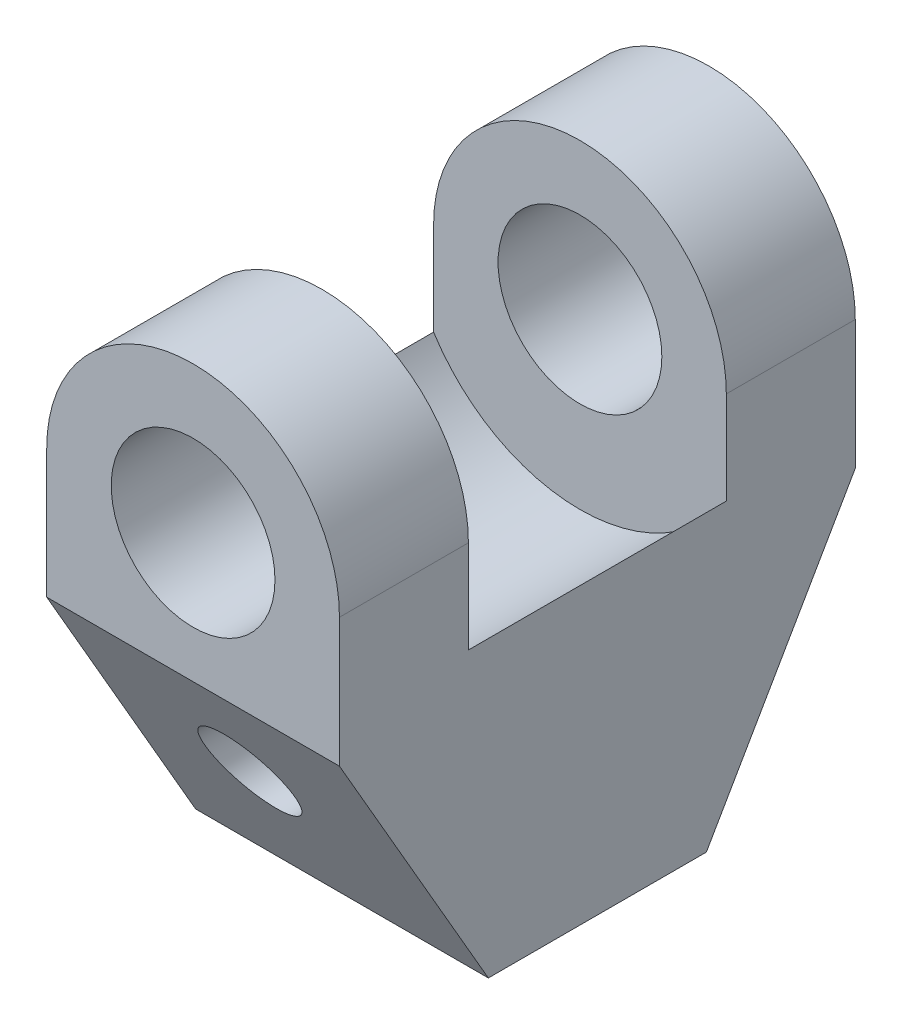
ISO-10303-21;
HEADER;
FILE_DESCRIPTION(('STEP AP214'),'2;1');
FILE_NAME('part.step','',(''),(''),'','','');
FILE_SCHEMA(('AUTOMOTIVE_DESIGN { 1 0 10303 214 1 1 1 1 }'));
ENDSEC;
DATA;
#1=APPLICATION_CONTEXT('core data for automotive mechanical design processes');
#2=APPLICATION_PROTOCOL_DEFINITION('international standard','automotive_design',2000,#1);
#3=PRODUCT_CONTEXT('',#1,'mechanical');
#4=PRODUCT('Part','Part','',(#3));
#5=PRODUCT_RELATED_PRODUCT_CATEGORY('part','',(#4));
#6=PRODUCT_DEFINITION_FORMATION('','',#4);
#7=PRODUCT_DEFINITION_CONTEXT('part definition',#1,'design');
#8=PRODUCT_DEFINITION('design','',#6,#7);
#9=PRODUCT_DEFINITION_SHAPE('','',#8);
#10=(LENGTH_UNIT() NAMED_UNIT(*) SI_UNIT(.MILLI.,.METRE.));
#11=(NAMED_UNIT(*) PLANE_ANGLE_UNIT() SI_UNIT($,.RADIAN.));
#12=(NAMED_UNIT(*) SI_UNIT($,.STERADIAN.) SOLID_ANGLE_UNIT());
#13=UNCERTAINTY_MEASURE_WITH_UNIT(LENGTH_MEASURE(1.E-05),#10,'distance_accuracy_value','');
#14=(GEOMETRIC_REPRESENTATION_CONTEXT(3) GLOBAL_UNCERTAINTY_ASSIGNED_CONTEXT((#13)) GLOBAL_UNIT_ASSIGNED_CONTEXT((#10,
#11,#12)) REPRESENTATION_CONTEXT('',''));
#15=CARTESIAN_POINT('',(0.,0.,0.));
#16=DIRECTION('',(0.,0.,1.));
#17=DIRECTION('',(1.,0.,0.));
#18=AXIS2_PLACEMENT_3D('',#15,#16,#17);
#19=CARTESIAN_POINT('',(4.20977283052519,0.,-10.));
#20=DIRECTION('',(-1.,0.,0.));
#21=DIRECTION('',(0.,-1.,0.));
#22=AXIS2_PLACEMENT_3D('',#19,#20,#21);
#23=PLANE('',#22);
#24=DIRECTION('',(0.,0.,1.));
#25=VECTOR('',#24,1.);
#26=CARTESIAN_POINT('',(4.2097728305252,-30.,-10.));
#27=LINE('',#26,#25);
#28=CARTESIAN_POINT('',(4.2097728305252,-30.,-12.25));
#29=VERTEX_POINT('',#28);
#30=CARTESIAN_POINT('',(4.2097728305252,-30.,-7.75));
#31=VERTEX_POINT('',#30);
#32=EDGE_CURVE('E250',#29,#31,#27,.T.);
#33=ORIENTED_EDGE('',*,*,#32,.T.);
#34=DIRECTION('',(0.,-1.,0.));
#35=VECTOR('',#34,1.);
#36=CARTESIAN_POINT('',(4.20977283052519,0.,-7.75));
#37=LINE('',#36,#35);
#38=CARTESIAN_POINT('',(4.20977283052519,-15.,-7.75));
#39=VERTEX_POINT('',#38);
#40=EDGE_CURVE('E235',#39,#31,#37,.T.);
#41=ORIENTED_EDGE('',*,*,#40,.F.);
#42=DIRECTION('',(0.,0.,1.));
#43=VECTOR('',#42,1.);
#44=CARTESIAN_POINT('',(4.20977283052519,-15.,-10.));
#45=LINE('',#44,#43);
#46=CARTESIAN_POINT('',(4.20977283052519,-15.,-12.25));
#47=VERTEX_POINT('',#46);
#48=EDGE_CURVE('E155',#47,#39,#45,.T.);
#49=ORIENTED_EDGE('',*,*,#48,.F.);
#50=DIRECTION('',(0.,-1.,0.));
#51=VECTOR('',#50,1.);
#52=CARTESIAN_POINT('',(4.20977283052519,0.,-12.25));
#53=LINE('',#52,#51);
#54=EDGE_CURVE('E170',#47,#29,#53,.T.);
#55=ORIENTED_EDGE('',*,*,#54,.T.);
#56=EDGE_LOOP('',(#33,#41,#49,#55));
#57=FACE_BOUND('',#56,.T.);
#58=ADVANCED_FACE('F43',(#57),#23,.T.);
#59=CARTESIAN_POINT('',(0.,-15.,-10.));
#60=DIRECTION('',(0.,1.,0.));
#61=DIRECTION('',(0.,0.,1.));
#62=AXIS2_PLACEMENT_3D('',#59,#60,#61);
#63=PLANE('',#62);
#64=DIRECTION('',(-1.,0.,0.));
#65=VECTOR('',#64,1.);
#66=CARTESIAN_POINT('',(0.,-15.,-7.75));
#67=LINE('',#66,#65);
#68=CARTESIAN_POINT('',(-5.79022716947481,-15.,-7.75));
#69=VERTEX_POINT('',#68);
#70=EDGE_CURVE('E152',#39,#69,#67,.T.);
#71=ORIENTED_EDGE('',*,*,#70,.T.);
#72=DIRECTION('',(0.,0.,1.));
#73=VECTOR('',#72,1.);
#74=CARTESIAN_POINT('',(-5.79022716947481,-15.,-10.));
#75=LINE('',#74,#73);
#76=CARTESIAN_POINT('',(-5.79022716947481,-15.,-12.25));
#77=VERTEX_POINT('',#76);
#78=EDGE_CURVE('E144',#77,#69,#75,.T.);
#79=ORIENTED_EDGE('',*,*,#78,.F.);
#80=DIRECTION('',(-1.,0.,0.));
#81=VECTOR('',#80,1.);
#82=CARTESIAN_POINT('',(0.,-15.,-12.25));
#83=LINE('',#82,#81);
#84=EDGE_CURVE('E149',#47,#77,#83,.T.);
#85=ORIENTED_EDGE('',*,*,#84,.F.);
#86=ORIENTED_EDGE('',*,*,#48,.T.);
#87=EDGE_LOOP('',(#71,#79,#85,#86));
#88=FACE_BOUND('',#87,.T.);
#89=ADVANCED_FACE('F146',(#88),#63,.F.);
#90=CARTESIAN_POINT('',(-5.79022716947481,0.,-10.));
#91=DIRECTION('',(-1.,0.,0.));
#92=DIRECTION('',(0.,-1.,0.));
#93=AXIS2_PLACEMENT_3D('',#90,#91,#92);
#94=PLANE('',#93);
#95=DIRECTION('',(0.,-1.,0.));
#96=VECTOR('',#95,1.);
#97=CARTESIAN_POINT('',(-5.79022716947481,0.,-7.75));
#98=LINE('',#97,#96);
#99=CARTESIAN_POINT('',(-5.7902271694748,-30.,-7.75));
#100=VERTEX_POINT('',#99);
#101=EDGE_CURVE('E230',#69,#100,#98,.T.);
#102=ORIENTED_EDGE('',*,*,#101,.T.);
#103=DIRECTION('',(0.,0.,1.));
#104=VECTOR('',#103,1.);
#105=CARTESIAN_POINT('',(-5.7902271694748,-30.,-10.));
#106=LINE('',#105,#104);
#107=CARTESIAN_POINT('',(-5.7902271694748,-30.,-12.25));
#108=VERTEX_POINT('',#107);
#109=EDGE_CURVE('E156',#108,#100,#106,.T.);
#110=ORIENTED_EDGE('',*,*,#109,.F.);
#111=DIRECTION('',(0.,-1.,0.));
#112=VECTOR('',#111,1.);
#113=CARTESIAN_POINT('',(-5.79022716947481,0.,-12.25));
#114=LINE('',#113,#112);
#115=EDGE_CURVE('E159',#77,#108,#114,.T.);
#116=ORIENTED_EDGE('',*,*,#115,.F.);
#117=ORIENTED_EDGE('',*,*,#78,.T.);
#118=EDGE_LOOP('',(#102,#110,#116,#117));
#119=FACE_BOUND('',#118,.T.);
#120=ADVANCED_FACE('F160',(#119),#94,.F.);
#121=CARTESIAN_POINT('',(0.,0.,0.));
#122=DIRECTION('',(0.,0.,1.));
#123=DIRECTION('',(1.,0.,0.));
#124=AXIS2_PLACEMENT_3D('',#121,#122,#123);
#125=PLANE('',#124);
#126=CARTESIAN_POINT('',(0.,0.,0.));
#127=DIRECTION('',(0.,0.,1.));
#128=DIRECTION('',(1.,0.,0.));
#129=AXIS2_PLACEMENT_3D('',#126,#127,#128);
#130=CIRCLE('',#129,6.35);
#131=CARTESIAN_POINT('',(6.35,0.,0.));
#132=VERTEX_POINT('',#131);
#133=EDGE_CURVE('E273',#132,#132,#130,.T.);
#134=ORIENTED_EDGE('',*,*,#133,.T.);
#135=EDGE_LOOP('',(#134));
#136=FACE_BOUND('',#135,.T.);
#137=CARTESIAN_POINT('',(0.,0.,0.));
#138=DIRECTION('',(0.,0.,1.));
#139=DIRECTION('',(1.,0.,0.));
#140=AXIS2_PLACEMENT_3D('',#137,#138,#139);
#141=CIRCLE('',#140,13.44);
#142=CARTESIAN_POINT('',(-11.35,-7.19799277576743,0.));
#143=VERTEX_POINT('',#142);
#144=CARTESIAN_POINT('',(11.35,-7.19799277576742,0.));
#145=VERTEX_POINT('',#144);
#146=EDGE_CURVE('E241',#143,#145,#141,.T.);
#147=ORIENTED_EDGE('',*,*,#146,.F.);
#148=DIRECTION('',(0.,-1.,0.));
#149=VECTOR('',#148,1.);
#150=CARTESIAN_POINT('',(-11.35,0.,0.));
#151=LINE('',#150,#149);
#152=CARTESIAN_POINT('',(-11.35,0.,0.));
#153=VERTEX_POINT('',#152);
#154=EDGE_CURVE('E249',#153,#143,#151,.T.);
#155=ORIENTED_EDGE('',*,*,#154,.F.);
#156=CARTESIAN_POINT('',(0.,0.,0.));
#157=DIRECTION('',(0.,0.,1.));
#158=DIRECTION('',(1.,0.,0.));
#159=AXIS2_PLACEMENT_3D('',#156,#157,#158);
#160=CIRCLE('',#159,11.35);
#161=CARTESIAN_POINT('',(11.35,0.,0.));
#162=VERTEX_POINT('',#161);
#163=EDGE_CURVE('E271',#162,#153,#160,.T.);
#164=ORIENTED_EDGE('',*,*,#163,.F.);
#165=DIRECTION('',(0.,-1.,0.));
#166=VECTOR('',#165,1.);
#167=CARTESIAN_POINT('',(11.35,0.,0.));
#168=LINE('',#167,#166);
#169=EDGE_CURVE('E268',#162,#145,#168,.T.);
#170=ORIENTED_EDGE('',*,*,#169,.T.);
#171=EDGE_LOOP('',(#147,#155,#164,#170));
#172=FACE_BOUND('',#171,.T.);
#173=ADVANCED_FACE('F353',(#136,#172),#125,.F.);
#174=CARTESIAN_POINT('',(-11.35,0.,10.));
#175=DIRECTION('',(1.,0.,0.));
#176=DIRECTION('',(0.,1.,0.));
#177=AXIS2_PLACEMENT_3D('',#174,#175,#176);
#178=PLANE('',#177);
#179=DIRECTION('',(0.,0.,-1.));
#180=VECTOR('',#179,1.);
#181=CARTESIAN_POINT('',(-11.35,-30.,10.));
#182=LINE('',#181,#180);
#183=CARTESIAN_POINT('',(-11.35,-30.,-1.54700538379252));
#184=VERTEX_POINT('',#183);
#185=CARTESIAN_POINT('',(-11.35,-30.,-18.4529946162075));
#186=VERTEX_POINT('',#185);
#187=EDGE_CURVE('E285',#184,#186,#182,.T.);
#188=ORIENTED_EDGE('',*,*,#187,.F.);
#189=DIRECTION('',(0.,0.86602540378444,0.499999999999998));
#190=VECTOR('',#189,1.);
#191=CARTESIAN_POINT('',(-11.35,-9.99999999999989,10.));
#192=LINE('',#191,#190);
#193=CARTESIAN_POINT('',(-11.35,-9.99999999999988,10.));
#194=VERTEX_POINT('',#193);
#195=EDGE_CURVE('E11',#184,#194,#192,.T.);
#196=ORIENTED_EDGE('',*,*,#195,.T.);
#197=DIRECTION('',(0.,-1.,0.));
#198=VECTOR('',#197,1.);
#199=CARTESIAN_POINT('',(-11.35,0.,10.));
#200=LINE('',#199,#198);
#201=CARTESIAN_POINT('',(-11.35,0.,10.));
#202=VERTEX_POINT('',#201);
#203=EDGE_CURVE('E255',#202,#194,#200,.T.);
#204=ORIENTED_EDGE('',*,*,#203,.F.);
#205=DIRECTION('',(0.,0.,-1.));
#206=VECTOR('',#205,1.);
#207=CARTESIAN_POINT('',(-11.35,0.,10.));
#208=LINE('',#207,#206);
#209=EDGE_CURVE('E278',#202,#153,#208,.T.);
#210=ORIENTED_EDGE('',*,*,#209,.T.);
#211=ORIENTED_EDGE('',*,*,#154,.T.);
#212=DIRECTION('',(0.,0.,1.));
#213=VECTOR('',#212,1.);
#214=CARTESIAN_POINT('',(-11.35,-7.19799277576743,-10.));
#215=LINE('',#214,#213);
#216=CARTESIAN_POINT('',(-11.35,-7.19799277576743,-20.));
#217=VERTEX_POINT('',#216);
#218=EDGE_CURVE('E246',#217,#143,#215,.T.);
#219=ORIENTED_EDGE('',*,*,#218,.F.);
#220=DIRECTION('',(0.,-1.,0.));
#221=VECTOR('',#220,1.);
#222=CARTESIAN_POINT('',(-11.35,0.,-20.));
#223=LINE('',#222,#221);
#224=CARTESIAN_POINT('',(-11.35,0.,-20.));
#225=VERTEX_POINT('',#224);
#226=EDGE_CURVE('E184',#225,#217,#223,.T.);
#227=ORIENTED_EDGE('',*,*,#226,.F.);
#228=DIRECTION('',(0.,0.,1.));
#229=VECTOR('',#228,1.);
#230=CARTESIAN_POINT('',(-11.35,0.,-30.));
#231=LINE('',#230,#229);
#232=CARTESIAN_POINT('',(-11.35,0.,-30.));
#233=VERTEX_POINT('',#232);
#234=EDGE_CURVE('E211',#233,#225,#231,.T.);
#235=ORIENTED_EDGE('',*,*,#234,.F.);
#236=DIRECTION('',(0.,-1.,0.));
#237=VECTOR('',#236,1.);
#238=CARTESIAN_POINT('',(-11.35,0.,-30.));
#239=LINE('',#238,#237);
#240=CARTESIAN_POINT('',(-11.35,-9.99999999999988,-30.));
#241=VERTEX_POINT('',#240);
#242=EDGE_CURVE('E185',#233,#241,#239,.T.);
#243=ORIENTED_EDGE('',*,*,#242,.T.);
#244=DIRECTION('',(0.,0.86602540378444,-0.499999999999998));
#245=VECTOR('',#244,1.);
#246=CARTESIAN_POINT('',(-11.35,-9.99999999999989,-30.));
#247=LINE('',#246,#245);
#248=EDGE_CURVE('E223',#186,#241,#247,.T.);
#249=ORIENTED_EDGE('',*,*,#248,.F.);
#250=EDGE_LOOP('',(#188,#196,#204,#210,#211,#219,#227,#235,#243,#249));
#251=FACE_BOUND('',#250,.T.);
#252=ADVANCED_FACE('F308',(#251),#178,.F.);
#253=CARTESIAN_POINT('',(0.,-30.,10.));
#254=DIRECTION('',(0.,1.,0.));
#255=DIRECTION('',(0.,0.,1.));
#256=AXIS2_PLACEMENT_3D('',#253,#254,#255);
#257=PLANE('',#256);
#258=DIRECTION('',(-1.,0.,0.));
#259=VECTOR('',#258,1.);
#260=CARTESIAN_POINT('',(-11.35,-30.,-18.4529946162075));
#261=LINE('',#260,#259);
#262=CARTESIAN_POINT('',(11.35,-30.,-18.4529946162075));
#263=VERTEX_POINT('',#262);
#264=EDGE_CURVE('E220',#263,#186,#261,.T.);
#265=ORIENTED_EDGE('',*,*,#264,.F.);
#266=DIRECTION('',(0.,0.,-1.));
#267=VECTOR('',#266,1.);
#268=CARTESIAN_POINT('',(11.35,-30.,10.));
#269=LINE('',#268,#267);
#270=CARTESIAN_POINT('',(11.35,-30.,-1.54700538379252));
#271=VERTEX_POINT('',#270);
#272=EDGE_CURVE('E283',#271,#263,#269,.T.);
#273=ORIENTED_EDGE('',*,*,#272,.F.);
#274=DIRECTION('',(-1.,0.,0.));
#275=VECTOR('',#274,1.);
#276=CARTESIAN_POINT('',(-11.35,-30.,-1.54700538379252));
#277=LINE('',#276,#275);
#278=EDGE_CURVE('E53',#271,#184,#277,.T.);
#279=ORIENTED_EDGE('',*,*,#278,.T.);
#280=ORIENTED_EDGE('',*,*,#187,.T.);
#281=EDGE_LOOP('',(#265,#273,#279,#280));
#282=FACE_BOUND('',#281,.T.);
#283=ORIENTED_EDGE('',*,*,#32,.F.);
#284=DIRECTION('',(1.,0.,0.));
#285=VECTOR('',#284,1.);
#286=CARTESIAN_POINT('',(0.,-30.,-12.25));
#287=LINE('',#286,#285);
#288=EDGE_CURVE('E165',#108,#29,#287,.T.);
#289=ORIENTED_EDGE('',*,*,#288,.F.);
#290=ORIENTED_EDGE('',*,*,#109,.T.);
#291=DIRECTION('',(1.,0.,0.));
#292=VECTOR('',#291,1.);
#293=CARTESIAN_POINT('',(0.,-30.,-7.75));
#294=LINE('',#293,#292);
#295=EDGE_CURVE('E232',#100,#31,#294,.T.);
#296=ORIENTED_EDGE('',*,*,#295,.T.);
#297=EDGE_LOOP('',(#283,#289,#290,#296));
#298=FACE_BOUND('',#297,.T.);
#299=ADVANCED_FACE('F368',(#282,#298),#257,.F.);
#300=CARTESIAN_POINT('',(11.35,0.,10.));
#301=DIRECTION('',(1.,0.,0.));
#302=DIRECTION('',(0.,1.,0.));
#303=AXIS2_PLACEMENT_3D('',#300,#301,#302);
#304=PLANE('',#303);
#305=DIRECTION('',(0.,-1.,0.));
#306=VECTOR('',#305,1.);
#307=CARTESIAN_POINT('',(11.35,0.,10.));
#308=LINE('',#307,#306);
#309=CARTESIAN_POINT('',(11.35,0.,10.));
#310=VERTEX_POINT('',#309);
#311=CARTESIAN_POINT('',(11.35,-9.99999999999988,10.));
#312=VERTEX_POINT('',#311);
#313=EDGE_CURVE('E258',#310,#312,#308,.T.);
#314=ORIENTED_EDGE('',*,*,#313,.T.);
#315=DIRECTION('',(0.,-0.86602540378444,-0.499999999999998));
#316=VECTOR('',#315,1.);
#317=CARTESIAN_POINT('',(11.35,-2.49999999999995,14.3301270189221));
#318=LINE('',#317,#316);
#319=EDGE_CURVE('E67',#312,#271,#318,.T.);
#320=ORIENTED_EDGE('',*,*,#319,.T.);
#321=ORIENTED_EDGE('',*,*,#272,.T.);
#322=DIRECTION('',(0.,-0.86602540378444,0.499999999999998));
#323=VECTOR('',#322,1.);
#324=CARTESIAN_POINT('',(11.35,-2.49999999999995,-34.3301270189221));
#325=LINE('',#324,#323);
#326=CARTESIAN_POINT('',(11.35,-9.99999999999988,-30.));
#327=VERTEX_POINT('',#326);
#328=EDGE_CURVE('E217',#327,#263,#325,.T.);
#329=ORIENTED_EDGE('',*,*,#328,.F.);
#330=DIRECTION('',(0.,-1.,0.));
#331=VECTOR('',#330,1.);
#332=CARTESIAN_POINT('',(11.35,0.,-30.));
#333=LINE('',#332,#331);
#334=CARTESIAN_POINT('',(11.35,0.,-30.));
#335=VERTEX_POINT('',#334);
#336=EDGE_CURVE('E188',#335,#327,#333,.T.);
#337=ORIENTED_EDGE('',*,*,#336,.F.);
#338=DIRECTION('',(0.,0.,1.));
#339=VECTOR('',#338,1.);
#340=CARTESIAN_POINT('',(11.35,0.,-30.));
#341=LINE('',#340,#339);
#342=CARTESIAN_POINT('',(11.35,0.,-20.));
#343=VERTEX_POINT('',#342);
#344=EDGE_CURVE('E213',#335,#343,#341,.T.);
#345=ORIENTED_EDGE('',*,*,#344,.T.);
#346=DIRECTION('',(0.,-1.,0.));
#347=VECTOR('',#346,1.);
#348=CARTESIAN_POINT('',(11.35,0.,-20.));
#349=LINE('',#348,#347);
#350=CARTESIAN_POINT('',(11.35,-7.19799277576742,-20.));
#351=VERTEX_POINT('',#350);
#352=EDGE_CURVE('E200',#343,#351,#349,.T.);
#353=ORIENTED_EDGE('',*,*,#352,.T.);
#354=DIRECTION('',(0.,0.,1.));
#355=VECTOR('',#354,1.);
#356=CARTESIAN_POINT('',(11.35,-7.19799277576742,-10.));
#357=LINE('',#356,#355);
#358=EDGE_CURVE('E247',#351,#145,#357,.T.);
#359=ORIENTED_EDGE('',*,*,#358,.T.);
#360=ORIENTED_EDGE('',*,*,#169,.F.);
#361=DIRECTION('',(0.,0.,-1.));
#362=VECTOR('',#361,1.);
#363=CARTESIAN_POINT('',(11.35,0.,10.));
#364=LINE('',#363,#362);
#365=EDGE_CURVE('E281',#310,#162,#364,.T.);
#366=ORIENTED_EDGE('',*,*,#365,.F.);
#367=EDGE_LOOP('',(#314,#320,#321,#329,#337,#345,#353,#359,#360,#366));
#368=FACE_BOUND('',#367,.T.);
#369=ADVANCED_FACE('F299',(#368),#304,.T.);
#370=CARTESIAN_POINT('',(0.,0.,10.));
#371=DIRECTION('',(0.,0.,-1.));
#372=DIRECTION('',(-1.,0.,0.));
#373=AXIS2_PLACEMENT_3D('',#370,#371,#372);
#374=CYLINDRICAL_SURFACE('',#373,6.35);
#375=CARTESIAN_POINT('',(0.,0.,10.));
#376=DIRECTION('',(0.,0.,1.));
#377=DIRECTION('',(1.,0.,0.));
#378=AXIS2_PLACEMENT_3D('',#375,#376,#377);
#379=CIRCLE('',#378,6.35);
#380=CARTESIAN_POINT('',(6.35,0.,10.));
#381=VERTEX_POINT('',#380);
#382=EDGE_CURVE('E263',#381,#381,#379,.T.);
#383=ORIENTED_EDGE('',*,*,#382,.T.);
#384=EDGE_LOOP('',(#383));
#385=FACE_BOUND('',#384,.T.);
#386=ORIENTED_EDGE('',*,*,#133,.F.);
#387=EDGE_LOOP('',(#386));
#388=FACE_BOUND('',#387,.T.);
#389=ADVANCED_FACE('F360',(#385,#388),#374,.F.);
#390=CARTESIAN_POINT('',(0.,0.,10.));
#391=DIRECTION('',(0.,0.,-1.));
#392=DIRECTION('',(-1.,0.,0.));
#393=AXIS2_PLACEMENT_3D('',#390,#391,#392);
#394=CYLINDRICAL_SURFACE('',#393,11.35);
#395=ORIENTED_EDGE('',*,*,#163,.T.);
#396=ORIENTED_EDGE('',*,*,#209,.F.);
#397=CARTESIAN_POINT('',(0.,0.,10.));
#398=DIRECTION('',(0.,0.,1.));
#399=DIRECTION('',(1.,0.,0.));
#400=AXIS2_PLACEMENT_3D('',#397,#398,#399);
#401=CIRCLE('',#400,11.35);
#402=EDGE_CURVE('E261',#310,#202,#401,.T.);
#403=ORIENTED_EDGE('',*,*,#402,.F.);
#404=ORIENTED_EDGE('',*,*,#365,.T.);
#405=EDGE_LOOP('',(#395,#396,#403,#404));
#406=FACE_BOUND('',#405,.T.);
#407=ADVANCED_FACE('F305',(#406),#394,.T.);
#408=CARTESIAN_POINT('',(-0.790227169474804,-19.,10.));
#409=DIRECTION('',(0.,0.,-1.));
#410=DIRECTION('',(-1.,0.,0.));
#411=AXIS2_PLACEMENT_3D('',#408,#409,#410);
#412=CYLINDRICAL_SURFACE('',#411,3.5);
#413=CARTESIAN_POINT('',(-0.790227169474804,-19.,4.80384757729333));
#414=DIRECTION('',(0.,-0.499999999999998,0.86602540378444));
#415=DIRECTION('',(0.,-0.86602540378444,-0.499999999999998));
#416=AXIS2_PLACEMENT_3D('',#413,#414,#415);
#417=ELLIPSE('',#416,4.04145188432738,3.5);
#418=CARTESIAN_POINT('',(-0.790227169474804,-22.5,2.78312163512965));
#419=VERTEX_POINT('',#418);
#420=EDGE_CURVE('E48',#419,#419,#417,.T.);
#421=ORIENTED_EDGE('',*,*,#420,.T.);
#422=EDGE_LOOP('',(#421));
#423=FACE_BOUND('',#422,.T.);
#424=CARTESIAN_POINT('',(-0.790227169474804,-19.,0.));
#425=DIRECTION('',(0.,0.,1.));
#426=DIRECTION('',(1.,0.,0.));
#427=AXIS2_PLACEMENT_3D('',#424,#425,#426);
#428=CIRCLE('',#427,3.5);
#429=CARTESIAN_POINT('',(2.7097728305252,-19.,0.));
#430=VERTEX_POINT('',#429);
#431=EDGE_CURVE('E259',#430,#430,#428,.T.);
#432=ORIENTED_EDGE('',*,*,#431,.F.);
#433=EDGE_LOOP('',(#432));
#434=FACE_BOUND('',#433,.T.);
#435=ADVANCED_FACE('F317',(#423,#434),#412,.F.);
#436=CARTESIAN_POINT('',(0.,0.,10.));
#437=DIRECTION('',(0.,0.,1.));
#438=DIRECTION('',(1.,0.,0.));
#439=AXIS2_PLACEMENT_3D('',#436,#437,#438);
#440=PLANE('',#439);
#441=ORIENTED_EDGE('',*,*,#203,.T.);
#442=DIRECTION('',(1.,0.,0.));
#443=VECTOR('',#442,1.);
#444=CARTESIAN_POINT('',(11.35,-9.99999999999988,10.));
#445=LINE('',#444,#443);
#446=EDGE_CURVE('E287',#194,#312,#445,.T.);
#447=ORIENTED_EDGE('',*,*,#446,.T.);
#448=ORIENTED_EDGE('',*,*,#313,.F.);
#449=ORIENTED_EDGE('',*,*,#402,.T.);
#450=EDGE_LOOP('',(#441,#447,#448,#449));
#451=FACE_BOUND('',#450,.T.);
#452=ORIENTED_EDGE('',*,*,#382,.F.);
#453=EDGE_LOOP('',(#452));
#454=FACE_BOUND('',#453,.T.);
#455=ADVANCED_FACE('F294',(#451,#454),#440,.T.);
#456=CARTESIAN_POINT('',(0.,0.,-10.));
#457=DIRECTION('',(0.,0.,1.));
#458=DIRECTION('',(1.,0.,0.));
#459=AXIS2_PLACEMENT_3D('',#456,#457,#458);
#460=CYLINDRICAL_SURFACE('',#459,13.44);
#461=ORIENTED_EDGE('',*,*,#146,.T.);
#462=ORIENTED_EDGE('',*,*,#358,.F.);
#463=CARTESIAN_POINT('',(0.,0.,-20.));
#464=DIRECTION('',(0.,0.,1.));
#465=DIRECTION('',(1.,0.,0.));
#466=AXIS2_PLACEMENT_3D('',#463,#464,#465);
#467=CIRCLE('',#466,13.44);
#468=EDGE_CURVE('E180',#217,#351,#467,.T.);
#469=ORIENTED_EDGE('',*,*,#468,.F.);
#470=ORIENTED_EDGE('',*,*,#218,.T.);
#471=EDGE_LOOP('',(#461,#462,#469,#470));
#472=FACE_BOUND('',#471,.T.);
#473=ADVANCED_FACE('F331',(#472),#460,.F.);
#474=CARTESIAN_POINT('',(-0.790227169474804,-19.,-7.75));
#475=DIRECTION('',(0.,0.,1.));
#476=DIRECTION('',(1.,0.,0.));
#477=AXIS2_PLACEMENT_3D('',#474,#475,#476);
#478=CYLINDRICAL_SURFACE('',#477,1.5);
#479=CARTESIAN_POINT('',(-0.790227169474804,-19.,-7.75));
#480=DIRECTION('',(0.,0.,1.));
#481=DIRECTION('',(1.,0.,0.));
#482=AXIS2_PLACEMENT_3D('',#479,#480,#481);
#483=CIRCLE('',#482,1.5);
#484=CARTESIAN_POINT('',(0.709772830525196,-19.,-7.75));
#485=VERTEX_POINT('',#484);
#486=EDGE_CURVE('E238',#485,#485,#483,.T.);
#487=ORIENTED_EDGE('',*,*,#486,.F.);
#488=EDGE_LOOP('',(#487));
#489=FACE_BOUND('',#488,.T.);
#490=CARTESIAN_POINT('',(-0.790227169474804,-19.,0.));
#491=DIRECTION('',(0.,0.,1.));
#492=DIRECTION('',(1.,0.,0.));
#493=AXIS2_PLACEMENT_3D('',#490,#491,#492);
#494=CIRCLE('',#493,1.5);
#495=CARTESIAN_POINT('',(0.709772830525196,-19.,0.));
#496=VERTEX_POINT('',#495);
#497=EDGE_CURVE('E226',#496,#496,#494,.T.);
#498=ORIENTED_EDGE('',*,*,#497,.T.);
#499=EDGE_LOOP('',(#498));
#500=FACE_BOUND('',#499,.T.);
#501=ADVANCED_FACE('F329',(#489,#500),#478,.F.);
#502=CARTESIAN_POINT('',(0.,0.,-7.75));
#503=DIRECTION('',(0.,0.,1.));
#504=DIRECTION('',(1.,0.,0.));
#505=AXIS2_PLACEMENT_3D('',#502,#503,#504);
#506=PLANE('',#505);
#507=ORIENTED_EDGE('',*,*,#70,.F.);
#508=ORIENTED_EDGE('',*,*,#40,.T.);
#509=ORIENTED_EDGE('',*,*,#295,.F.);
#510=ORIENTED_EDGE('',*,*,#101,.F.);
#511=EDGE_LOOP('',(#507,#508,#509,#510));
#512=FACE_BOUND('',#511,.T.);
#513=ORIENTED_EDGE('',*,*,#486,.T.);
#514=EDGE_LOOP('',(#513));
#515=FACE_BOUND('',#514,.T.);
#516=ADVANCED_FACE('F325',(#512,#515),#506,.F.);
#517=CARTESIAN_POINT('',(0.,0.,0.));
#518=DIRECTION('',(0.,0.,1.));
#519=DIRECTION('',(1.,0.,0.));
#520=AXIS2_PLACEMENT_3D('',#517,#518,#519);
#521=PLANE('',#520);
#522=ORIENTED_EDGE('',*,*,#431,.T.);
#523=EDGE_LOOP('',(#522));
#524=FACE_BOUND('',#523,.T.);
#525=ORIENTED_EDGE('',*,*,#497,.F.);
#526=EDGE_LOOP('',(#525));
#527=FACE_BOUND('',#526,.T.);
#528=ADVANCED_FACE('F313',(#524,#527),#521,.T.);
#529=CARTESIAN_POINT('',(0.,-9.99999999999988,10.));
#530=DIRECTION('',(0.,-0.499999999999998,0.86602540378444));
#531=DIRECTION('',(-1.,0.,0.));
#532=AXIS2_PLACEMENT_3D('',#529,#530,#531);
#533=PLANE('',#532);
#534=ORIENTED_EDGE('',*,*,#195,.F.);
#535=ORIENTED_EDGE('',*,*,#278,.F.);
#536=ORIENTED_EDGE('',*,*,#319,.F.);
#537=ORIENTED_EDGE('',*,*,#446,.F.);
#538=EDGE_LOOP('',(#534,#535,#536,#537));
#539=FACE_BOUND('',#538,.T.);
#540=ORIENTED_EDGE('',*,*,#420,.F.);
#541=EDGE_LOOP('',(#540));
#542=FACE_BOUND('',#541,.T.);
#543=ADVANCED_FACE('F46',(#539,#542),#533,.T.);
#544=CARTESIAN_POINT('',(0.,0.,-20.));
#545=DIRECTION('',(0.,0.,-1.));
#546=DIRECTION('',(1.,0.,0.));
#547=AXIS2_PLACEMENT_3D('',#544,#545,#546);
#548=PLANE('',#547);
#549=CARTESIAN_POINT('',(0.,0.,-20.));
#550=DIRECTION('',(0.,0.,1.));
#551=DIRECTION('',(1.,0.,0.));
#552=AXIS2_PLACEMENT_3D('',#549,#550,#551);
#553=CIRCLE('',#552,6.35);
#554=CARTESIAN_POINT('',(6.35,0.,-20.));
#555=VERTEX_POINT('',#554);
#556=EDGE_CURVE('E206',#555,#555,#553,.T.);
#557=ORIENTED_EDGE('',*,*,#556,.F.);
#558=EDGE_LOOP('',(#557));
#559=FACE_BOUND('',#558,.T.);
#560=ORIENTED_EDGE('',*,*,#468,.T.);
#561=ORIENTED_EDGE('',*,*,#352,.F.);
#562=CARTESIAN_POINT('',(0.,0.,-20.));
#563=DIRECTION('',(0.,0.,1.));
#564=DIRECTION('',(1.,0.,0.));
#565=AXIS2_PLACEMENT_3D('',#562,#563,#564);
#566=CIRCLE('',#565,11.35);
#567=EDGE_CURVE('E203',#343,#225,#566,.T.);
#568=ORIENTED_EDGE('',*,*,#567,.T.);
#569=ORIENTED_EDGE('',*,*,#226,.T.);
#570=EDGE_LOOP('',(#560,#561,#568,#569));
#571=FACE_BOUND('',#570,.T.);
#572=ADVANCED_FACE('F312',(#559,#571),#548,.F.);
#573=CARTESIAN_POINT('',(0.,0.,-30.));
#574=DIRECTION('',(0.,0.,1.));
#575=DIRECTION('',(-1.,0.,0.));
#576=AXIS2_PLACEMENT_3D('',#573,#574,#575);
#577=CYLINDRICAL_SURFACE('',#576,6.35);
#578=CARTESIAN_POINT('',(0.,0.,-30.));
#579=DIRECTION('',(0.,0.,1.));
#580=DIRECTION('',(1.,0.,0.));
#581=AXIS2_PLACEMENT_3D('',#578,#579,#580);
#582=CIRCLE('',#581,6.35);
#583=CARTESIAN_POINT('',(6.35,0.,-30.));
#584=VERTEX_POINT('',#583);
#585=EDGE_CURVE('E194',#584,#584,#582,.T.);
#586=ORIENTED_EDGE('',*,*,#585,.F.);
#587=EDGE_LOOP('',(#586));
#588=FACE_BOUND('',#587,.T.);
#589=ORIENTED_EDGE('',*,*,#556,.T.);
#590=EDGE_LOOP('',(#589));
#591=FACE_BOUND('',#590,.T.);
#592=ADVANCED_FACE('F399',(#588,#591),#577,.F.);
#593=CARTESIAN_POINT('',(0.,0.,-30.));
#594=DIRECTION('',(0.,0.,1.));
#595=DIRECTION('',(-1.,0.,0.));
#596=AXIS2_PLACEMENT_3D('',#593,#594,#595);
#597=CYLINDRICAL_SURFACE('',#596,11.35);
#598=ORIENTED_EDGE('',*,*,#567,.F.);
#599=ORIENTED_EDGE('',*,*,#344,.F.);
#600=CARTESIAN_POINT('',(0.,0.,-30.));
#601=DIRECTION('',(0.,0.,1.));
#602=DIRECTION('',(1.,0.,0.));
#603=AXIS2_PLACEMENT_3D('',#600,#601,#602);
#604=CIRCLE('',#603,11.35);
#605=EDGE_CURVE('E192',#335,#233,#604,.T.);
#606=ORIENTED_EDGE('',*,*,#605,.T.);
#607=ORIENTED_EDGE('',*,*,#234,.T.);
#608=EDGE_LOOP('',(#598,#599,#606,#607));
#609=FACE_BOUND('',#608,.T.);
#610=ADVANCED_FACE('F408',(#609),#597,.T.);
#611=CARTESIAN_POINT('',(-0.790227169474804,-19.,-30.));
#612=DIRECTION('',(0.,0.,1.));
#613=DIRECTION('',(-1.,0.,0.));
#614=AXIS2_PLACEMENT_3D('',#611,#612,#613);
#615=CYLINDRICAL_SURFACE('',#614,3.5);
#616=CARTESIAN_POINT('',(-0.790227169474804,-19.,-24.8038475772933));
#617=DIRECTION('',(0.,0.499999999999998,0.86602540378444));
#618=DIRECTION('',(0.,-0.86602540378444,0.499999999999998));
#619=AXIS2_PLACEMENT_3D('',#616,#617,#618);
#620=ELLIPSE('',#619,4.04145188432738,3.5);
#621=CARTESIAN_POINT('',(-0.790227169474804,-22.5,-22.7831216351296));
#622=VERTEX_POINT('',#621);
#623=EDGE_CURVE('E197',#622,#622,#620,.T.);
#624=ORIENTED_EDGE('',*,*,#623,.F.);
#625=EDGE_LOOP('',(#624));
#626=FACE_BOUND('',#625,.T.);
#627=CARTESIAN_POINT('',(-0.790227169474804,-19.,-20.));
#628=DIRECTION('',(0.,0.,1.));
#629=DIRECTION('',(1.,0.,0.));
#630=AXIS2_PLACEMENT_3D('',#627,#628,#629);
#631=CIRCLE('',#630,3.5);
#632=CARTESIAN_POINT('',(2.7097728305252,-19.,-20.));
#633=VERTEX_POINT('',#632);
#634=EDGE_CURVE('E189',#633,#633,#631,.T.);
#635=ORIENTED_EDGE('',*,*,#634,.T.);
#636=EDGE_LOOP('',(#635));
#637=FACE_BOUND('',#636,.T.);
#638=ADVANCED_FACE('F417',(#626,#637),#615,.F.);
#639=CARTESIAN_POINT('',(0.,0.,-30.));
#640=DIRECTION('',(0.,0.,-1.));
#641=DIRECTION('',(1.,0.,0.));
#642=AXIS2_PLACEMENT_3D('',#639,#640,#641);
#643=PLANE('',#642);
#644=ORIENTED_EDGE('',*,*,#242,.F.);
#645=ORIENTED_EDGE('',*,*,#605,.F.);
#646=ORIENTED_EDGE('',*,*,#336,.T.);
#647=DIRECTION('',(1.,0.,0.));
#648=VECTOR('',#647,1.);
#649=CARTESIAN_POINT('',(11.35,-9.99999999999988,-30.));
#650=LINE('',#649,#648);
#651=EDGE_CURVE('E215',#241,#327,#650,.T.);
#652=ORIENTED_EDGE('',*,*,#651,.F.);
#653=EDGE_LOOP('',(#644,#645,#646,#652));
#654=FACE_BOUND('',#653,.T.);
#655=ORIENTED_EDGE('',*,*,#585,.T.);
#656=EDGE_LOOP('',(#655));
#657=FACE_BOUND('',#656,.T.);
#658=ADVANCED_FACE('F426',(#654,#657),#643,.T.);
#659=CARTESIAN_POINT('',(-0.790227169474804,-19.,-12.25));
#660=DIRECTION('',(0.,0.,-1.));
#661=DIRECTION('',(1.,0.,0.));
#662=AXIS2_PLACEMENT_3D('',#659,#660,#661);
#663=CYLINDRICAL_SURFACE('',#662,1.5);
#664=CARTESIAN_POINT('',(-0.790227169474804,-19.,-12.25));
#665=DIRECTION('',(0.,0.,1.));
#666=DIRECTION('',(1.,0.,0.));
#667=AXIS2_PLACEMENT_3D('',#664,#665,#666);
#668=CIRCLE('',#667,1.5);
#669=CARTESIAN_POINT('',(0.709772830525196,-19.,-12.25));
#670=VERTEX_POINT('',#669);
#671=EDGE_CURVE('E178',#670,#670,#668,.T.);
#672=ORIENTED_EDGE('',*,*,#671,.T.);
#673=EDGE_LOOP('',(#672));
#674=FACE_BOUND('',#673,.T.);
#675=CARTESIAN_POINT('',(-0.790227169474804,-19.,-20.));
#676=DIRECTION('',(0.,0.,1.));
#677=DIRECTION('',(1.,0.,0.));
#678=AXIS2_PLACEMENT_3D('',#675,#676,#677);
#679=CIRCLE('',#678,1.5);
#680=CARTESIAN_POINT('',(0.709772830525196,-19.,-20.));
#681=VERTEX_POINT('',#680);
#682=EDGE_CURVE('E171',#681,#681,#679,.T.);
#683=ORIENTED_EDGE('',*,*,#682,.F.);
#684=EDGE_LOOP('',(#683));
#685=FACE_BOUND('',#684,.T.);
#686=ADVANCED_FACE('F436',(#674,#685),#663,.F.);
#687=CARTESIAN_POINT('',(0.,0.,-12.25));
#688=DIRECTION('',(0.,0.,-1.));
#689=DIRECTION('',(1.,0.,0.));
#690=AXIS2_PLACEMENT_3D('',#687,#688,#689);
#691=PLANE('',#690);
#692=ORIENTED_EDGE('',*,*,#84,.T.);
#693=ORIENTED_EDGE('',*,*,#115,.T.);
#694=ORIENTED_EDGE('',*,*,#288,.T.);
#695=ORIENTED_EDGE('',*,*,#54,.F.);
#696=EDGE_LOOP('',(#692,#693,#694,#695));
#697=FACE_BOUND('',#696,.T.);
#698=ORIENTED_EDGE('',*,*,#671,.F.);
#699=EDGE_LOOP('',(#698));
#700=FACE_BOUND('',#699,.T.);
#701=ADVANCED_FACE('F167',(#697,#700),#691,.F.);
#702=CARTESIAN_POINT('',(0.,0.,-20.));
#703=DIRECTION('',(0.,0.,-1.));
#704=DIRECTION('',(1.,0.,0.));
#705=AXIS2_PLACEMENT_3D('',#702,#703,#704);
#706=PLANE('',#705);
#707=ORIENTED_EDGE('',*,*,#634,.F.);
#708=EDGE_LOOP('',(#707));
#709=FACE_BOUND('',#708,.T.);
#710=ORIENTED_EDGE('',*,*,#682,.T.);
#711=EDGE_LOOP('',(#710));
#712=FACE_BOUND('',#711,.T.);
#713=ADVANCED_FACE('F454',(#709,#712),#706,.T.);
#714=CARTESIAN_POINT('',(0.,-9.99999999999988,-30.));
#715=DIRECTION('',(0.,-0.499999999999998,-0.86602540378444));
#716=DIRECTION('',(-1.,0.,0.));
#717=AXIS2_PLACEMENT_3D('',#714,#715,#716);
#718=PLANE('',#717);
#719=ORIENTED_EDGE('',*,*,#248,.T.);
#720=ORIENTED_EDGE('',*,*,#651,.T.);
#721=ORIENTED_EDGE('',*,*,#328,.T.);
#722=ORIENTED_EDGE('',*,*,#264,.T.);
#723=EDGE_LOOP('',(#719,#720,#721,#722));
#724=FACE_BOUND('',#723,.T.);
#725=ORIENTED_EDGE('',*,*,#623,.T.);
#726=EDGE_LOOP('',(#725));
#727=FACE_BOUND('',#726,.T.);
#728=ADVANCED_FACE('F462',(#724,#727),#718,.T.);
#729=CLOSED_SHELL('',(#58,#89,#120,#173,#252,#299,#369,#389,#407,#435,#455,#473,#501,#516,#528,
#543,#572,#592,#610,#638,#658,#686,#701,#713,#728));
#730=MANIFOLD_SOLID_BREP('B2',#729);
#731=ADVANCED_BREP_SHAPE_REPRESENTATION('',(#18,#730),#14);
#732=SHAPE_DEFINITION_REPRESENTATION(#9,#731);
ENDSEC;
END-ISO-10303-21;
